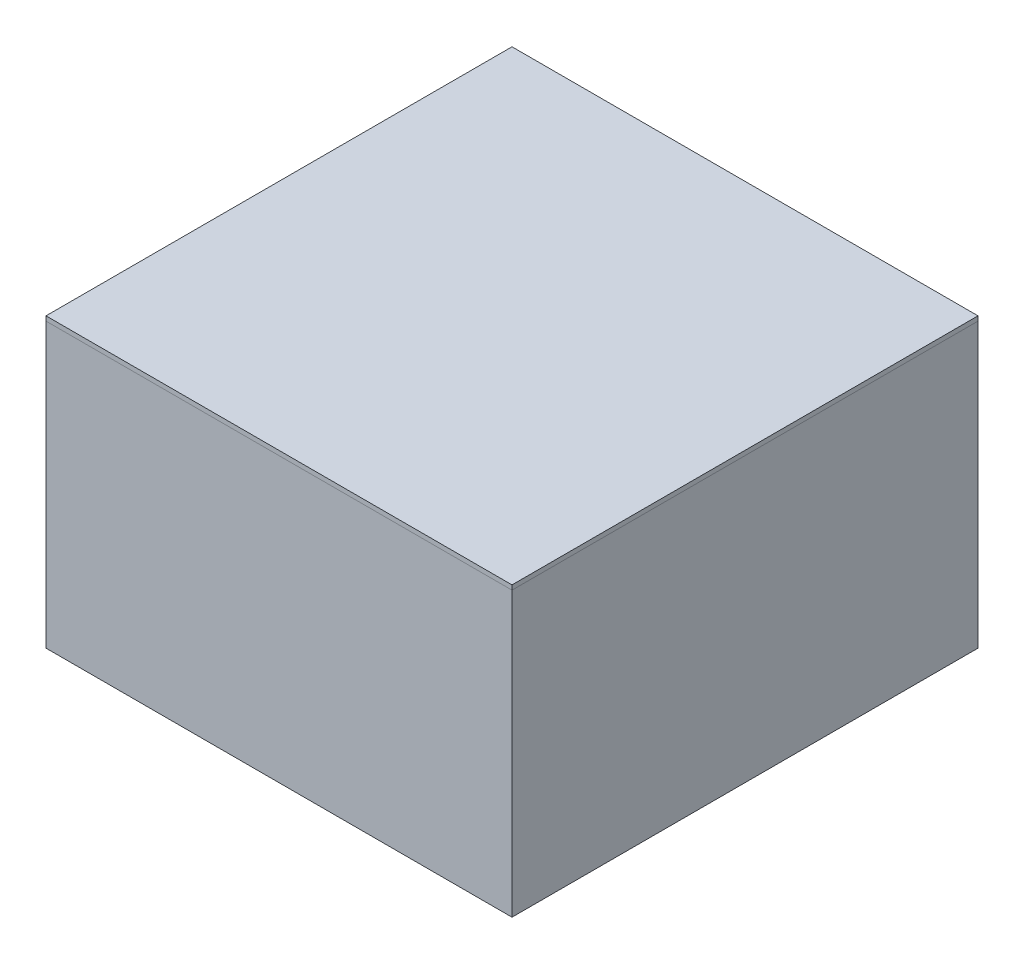
ISO-10303-21;
HEADER;
FILE_DESCRIPTION(('STEP AP214'),'2;1');
FILE_NAME('part.step','',(''),(''),'','','');
FILE_SCHEMA(('AUTOMOTIVE_DESIGN { 1 0 10303 214 1 1 1 1 }'));
ENDSEC;
DATA;
#1=APPLICATION_CONTEXT('core data for automotive mechanical design processes');
#2=APPLICATION_PROTOCOL_DEFINITION('international standard','automotive_design',2000,#1);
#3=PRODUCT_CONTEXT('',#1,'mechanical');
#4=PRODUCT('Part','Part','',(#3));
#5=PRODUCT_RELATED_PRODUCT_CATEGORY('part','',(#4));
#6=PRODUCT_DEFINITION_FORMATION('','',#4);
#7=PRODUCT_DEFINITION_CONTEXT('part definition',#1,'design');
#8=PRODUCT_DEFINITION('design','',#6,#7);
#9=PRODUCT_DEFINITION_SHAPE('','',#8);
#10=(LENGTH_UNIT() NAMED_UNIT(*) SI_UNIT(.MILLI.,.METRE.));
#11=(NAMED_UNIT(*) PLANE_ANGLE_UNIT() SI_UNIT($,.RADIAN.));
#12=(NAMED_UNIT(*) SI_UNIT($,.STERADIAN.) SOLID_ANGLE_UNIT());
#13=UNCERTAINTY_MEASURE_WITH_UNIT(LENGTH_MEASURE(1.E-05),#10,'distance_accuracy_value','');
#14=(GEOMETRIC_REPRESENTATION_CONTEXT(3) GLOBAL_UNCERTAINTY_ASSIGNED_CONTEXT((#13)) GLOBAL_UNIT_ASSIGNED_CONTEXT((#10,
#11,#12)) REPRESENTATION_CONTEXT('',''));
#15=CARTESIAN_POINT('',(0.,0.,0.));
#16=DIRECTION('',(0.,0.,1.));
#17=DIRECTION('',(1.,0.,0.));
#18=AXIS2_PLACEMENT_3D('',#15,#16,#17);
#19=CARTESIAN_POINT('',(-49.9,29.5,-49.9));
#20=DIRECTION('',(-1.,0.,0.));
#21=DIRECTION('',(0.,0.,1.));
#22=AXIS2_PLACEMENT_3D('',#19,#20,#21);
#23=PLANE('',#22);
#24=DIRECTION('',(0.,0.,1.));
#25=VECTOR('',#24,1.);
#26=CARTESIAN_POINT('',(-49.9,31.,-49.9));
#27=LINE('',#26,#25);
#28=CARTESIAN_POINT('',(-49.9,31.,-49.9));
#29=VERTEX_POINT('',#28);
#30=CARTESIAN_POINT('',(-49.9,31.,49.9));
#31=VERTEX_POINT('',#30);
#32=EDGE_CURVE('E148',#29,#31,#27,.T.);
#33=ORIENTED_EDGE('',*,*,#32,.F.);
#34=DIRECTION('',(0.,1.,0.));
#35=VECTOR('',#34,1.);
#36=CARTESIAN_POINT('',(-49.9,29.5,-49.9));
#37=LINE('',#36,#35);
#38=CARTESIAN_POINT('',(-49.9,29.5,-49.9));
#39=VERTEX_POINT('',#38);
#40=EDGE_CURVE('E12',#39,#29,#37,.T.);
#41=ORIENTED_EDGE('',*,*,#40,.F.);
#42=DIRECTION('',(0.,0.,1.));
#43=VECTOR('',#42,1.);
#44=CARTESIAN_POINT('',(-49.9,29.5,-49.9));
#45=LINE('',#44,#43);
#46=CARTESIAN_POINT('',(-49.9,29.5,49.9));
#47=VERTEX_POINT('',#46);
#48=EDGE_CURVE('E157',#39,#47,#45,.T.);
#49=ORIENTED_EDGE('',*,*,#48,.T.);
#50=DIRECTION('',(0.,1.,0.));
#51=VECTOR('',#50,1.);
#52=CARTESIAN_POINT('',(-49.9,29.5,49.9));
#53=LINE('',#52,#51);
#54=EDGE_CURVE('E56',#47,#31,#53,.T.);
#55=ORIENTED_EDGE('',*,*,#54,.T.);
#56=EDGE_LOOP('',(#33,#41,#49,#55));
#57=FACE_BOUND('',#56,.T.);
#58=ADVANCED_FACE('F53',(#57),#23,.T.);
#59=CARTESIAN_POINT('',(49.9,29.5,-49.9));
#60=DIRECTION('',(0.,0.,-1.));
#61=DIRECTION('',(-1.,0.,0.));
#62=AXIS2_PLACEMENT_3D('',#59,#60,#61);
#63=PLANE('',#62);
#64=DIRECTION('',(-1.,0.,0.));
#65=VECTOR('',#64,1.);
#66=CARTESIAN_POINT('',(49.9,31.,-49.9));
#67=LINE('',#66,#65);
#68=CARTESIAN_POINT('',(49.9,31.,-49.9));
#69=VERTEX_POINT('',#68);
#70=EDGE_CURVE('E160',#69,#29,#67,.T.);
#71=ORIENTED_EDGE('',*,*,#70,.F.);
#72=DIRECTION('',(0.,1.,0.));
#73=VECTOR('',#72,1.);
#74=CARTESIAN_POINT('',(49.9,29.5,-49.9));
#75=LINE('',#74,#73);
#76=CARTESIAN_POINT('',(49.9,29.5,-49.9));
#77=VERTEX_POINT('',#76);
#78=EDGE_CURVE('E62',#77,#69,#75,.T.);
#79=ORIENTED_EDGE('',*,*,#78,.F.);
#80=DIRECTION('',(-1.,0.,0.));
#81=VECTOR('',#80,1.);
#82=CARTESIAN_POINT('',(49.9,29.5,-49.9));
#83=LINE('',#82,#81);
#84=EDGE_CURVE('E164',#77,#39,#83,.T.);
#85=ORIENTED_EDGE('',*,*,#84,.T.);
#86=ORIENTED_EDGE('',*,*,#40,.T.);
#87=EDGE_LOOP('',(#71,#79,#85,#86));
#88=FACE_BOUND('',#87,.T.);
#89=ADVANCED_FACE('F178',(#88),#63,.T.);
#90=CARTESIAN_POINT('',(49.9,29.5,49.9));
#91=DIRECTION('',(1.,0.,0.));
#92=DIRECTION('',(0.,0.,-1.));
#93=AXIS2_PLACEMENT_3D('',#90,#91,#92);
#94=PLANE('',#93);
#95=DIRECTION('',(0.,0.,-1.));
#96=VECTOR('',#95,1.);
#97=CARTESIAN_POINT('',(49.9,31.,49.9));
#98=LINE('',#97,#96);
#99=CARTESIAN_POINT('',(49.9,31.,49.9));
#100=VERTEX_POINT('',#99);
#101=EDGE_CURVE('E169',#100,#69,#98,.T.);
#102=ORIENTED_EDGE('',*,*,#101,.F.);
#103=DIRECTION('',(0.,1.,0.));
#104=VECTOR('',#103,1.);
#105=CARTESIAN_POINT('',(49.9,29.5,49.9));
#106=LINE('',#105,#104);
#107=CARTESIAN_POINT('',(49.9,29.5,49.9));
#108=VERTEX_POINT('',#107);
#109=EDGE_CURVE('E85',#108,#100,#106,.T.);
#110=ORIENTED_EDGE('',*,*,#109,.F.);
#111=DIRECTION('',(0.,0.,-1.));
#112=VECTOR('',#111,1.);
#113=CARTESIAN_POINT('',(49.9,29.5,49.9));
#114=LINE('',#113,#112);
#115=EDGE_CURVE('E162',#108,#77,#114,.T.);
#116=ORIENTED_EDGE('',*,*,#115,.T.);
#117=ORIENTED_EDGE('',*,*,#78,.T.);
#118=EDGE_LOOP('',(#102,#110,#116,#117));
#119=FACE_BOUND('',#118,.T.);
#120=ADVANCED_FACE('F183',(#119),#94,.T.);
#121=CARTESIAN_POINT('',(-49.9,29.5,49.9));
#122=DIRECTION('',(0.,0.,1.));
#123=DIRECTION('',(1.,0.,0.));
#124=AXIS2_PLACEMENT_3D('',#121,#122,#123);
#125=PLANE('',#124);
#126=DIRECTION('',(1.,0.,0.));
#127=VECTOR('',#126,1.);
#128=CARTESIAN_POINT('',(-49.9,31.,49.9));
#129=LINE('',#128,#127);
#130=EDGE_CURVE('E151',#31,#100,#129,.T.);
#131=ORIENTED_EDGE('',*,*,#130,.F.);
#132=ORIENTED_EDGE('',*,*,#54,.F.);
#133=DIRECTION('',(1.,0.,0.));
#134=VECTOR('',#133,1.);
#135=CARTESIAN_POINT('',(-49.9,29.5,49.9));
#136=LINE('',#135,#134);
#137=EDGE_CURVE('E159',#47,#108,#136,.T.);
#138=ORIENTED_EDGE('',*,*,#137,.T.);
#139=ORIENTED_EDGE('',*,*,#109,.T.);
#140=EDGE_LOOP('',(#131,#132,#138,#139));
#141=FACE_BOUND('',#140,.T.);
#142=ADVANCED_FACE('F174',(#141),#125,.T.);
#143=CARTESIAN_POINT('',(0.,29.5,0.));
#144=DIRECTION('',(0.,1.,0.));
#145=DIRECTION('',(0.,0.,1.));
#146=AXIS2_PLACEMENT_3D('',#143,#144,#145);
#147=PLANE('',#146);
#148=ORIENTED_EDGE('',*,*,#48,.F.);
#149=ORIENTED_EDGE('',*,*,#84,.F.);
#150=ORIENTED_EDGE('',*,*,#115,.F.);
#151=ORIENTED_EDGE('',*,*,#137,.F.);
#152=EDGE_LOOP('',(#148,#149,#150,#151));
#153=FACE_BOUND('',#152,.T.);
#154=ADVANCED_FACE('F182',(#153),#147,.F.);
#155=CARTESIAN_POINT('',(0.,31.,0.));
#156=DIRECTION('',(0.,1.,0.));
#157=DIRECTION('',(0.,0.,1.));
#158=AXIS2_PLACEMENT_3D('',#155,#156,#157);
#159=PLANE('',#158);
#160=DIRECTION('',(0.,0.,1.));
#161=VECTOR('',#160,1.);
#162=CARTESIAN_POINT('',(-51.,31.,-51.));
#163=LINE('',#162,#161);
#164=CARTESIAN_POINT('',(-51.,31.,-51.));
#165=VERTEX_POINT('',#164);
#166=CARTESIAN_POINT('',(-51.,31.,51.));
#167=VERTEX_POINT('',#166);
#168=EDGE_CURVE('E147',#165,#167,#163,.T.);
#169=ORIENTED_EDGE('',*,*,#168,.F.);
#170=DIRECTION('',(-1.,0.,0.));
#171=VECTOR('',#170,1.);
#172=CARTESIAN_POINT('',(-51.,31.,-51.));
#173=LINE('',#172,#171);
#174=CARTESIAN_POINT('',(51.,31.,-51.));
#175=VERTEX_POINT('',#174);
#176=EDGE_CURVE('E143',#175,#165,#173,.T.);
#177=ORIENTED_EDGE('',*,*,#176,.F.);
#178=DIRECTION('',(0.,0.,-1.));
#179=VECTOR('',#178,1.);
#180=CARTESIAN_POINT('',(51.,31.,-51.));
#181=LINE('',#180,#179);
#182=CARTESIAN_POINT('',(51.,31.,51.));
#183=VERTEX_POINT('',#182);
#184=EDGE_CURVE('E279',#183,#175,#181,.T.);
#185=ORIENTED_EDGE('',*,*,#184,.F.);
#186=DIRECTION('',(1.,0.,0.));
#187=VECTOR('',#186,1.);
#188=CARTESIAN_POINT('',(-51.,31.,51.));
#189=LINE('',#188,#187);
#190=EDGE_CURVE('E282',#167,#183,#189,.T.);
#191=ORIENTED_EDGE('',*,*,#190,.F.);
#192=EDGE_LOOP('',(#169,#177,#185,#191));
#193=FACE_BOUND('',#192,.T.);
#194=ORIENTED_EDGE('',*,*,#70,.T.);
#195=ORIENTED_EDGE('',*,*,#32,.T.);
#196=ORIENTED_EDGE('',*,*,#130,.T.);
#197=ORIENTED_EDGE('',*,*,#101,.T.);
#198=EDGE_LOOP('',(#194,#195,#196,#197));
#199=FACE_BOUND('',#198,.T.);
#200=ADVANCED_FACE('F176',(#193,#199),#159,.F.);
#201=CARTESIAN_POINT('',(-51.,32.,-51.));
#202=DIRECTION('',(1.,0.,0.));
#203=DIRECTION('',(0.,0.,-1.));
#204=AXIS2_PLACEMENT_3D('',#201,#202,#203);
#205=PLANE('',#204);
#206=ORIENTED_EDGE('',*,*,#168,.T.);
#207=DIRECTION('',(0.,-1.,0.));
#208=VECTOR('',#207,1.);
#209=CARTESIAN_POINT('',(-51.,32.,51.));
#210=LINE('',#209,#208);
#211=CARTESIAN_POINT('',(-51.,32.,51.));
#212=VERTEX_POINT('',#211);
#213=EDGE_CURVE('E127',#212,#167,#210,.T.);
#214=ORIENTED_EDGE('',*,*,#213,.F.);
#215=DIRECTION('',(0.,0.,1.));
#216=VECTOR('',#215,1.);
#217=CARTESIAN_POINT('',(-51.,32.,-51.));
#218=LINE('',#217,#216);
#219=CARTESIAN_POINT('',(-51.,32.,-51.));
#220=VERTEX_POINT('',#219);
#221=EDGE_CURVE('E134',#220,#212,#218,.T.);
#222=ORIENTED_EDGE('',*,*,#221,.F.);
#223=DIRECTION('',(0.,-1.,0.));
#224=VECTOR('',#223,1.);
#225=CARTESIAN_POINT('',(-51.,32.,-51.));
#226=LINE('',#225,#224);
#227=EDGE_CURVE('E276',#220,#165,#226,.T.);
#228=ORIENTED_EDGE('',*,*,#227,.T.);
#229=EDGE_LOOP('',(#206,#214,#222,#228));
#230=FACE_BOUND('',#229,.T.);
#231=ADVANCED_FACE('F145',(#230),#205,.F.);
#232=CARTESIAN_POINT('',(-51.,32.,51.));
#233=DIRECTION('',(0.,0.,-1.));
#234=DIRECTION('',(-1.,0.,0.));
#235=AXIS2_PLACEMENT_3D('',#232,#233,#234);
#236=PLANE('',#235);
#237=ORIENTED_EDGE('',*,*,#190,.T.);
#238=DIRECTION('',(0.,-1.,0.));
#239=VECTOR('',#238,1.);
#240=CARTESIAN_POINT('',(51.,32.,51.));
#241=LINE('',#240,#239);
#242=CARTESIAN_POINT('',(51.,32.,51.));
#243=VERTEX_POINT('',#242);
#244=EDGE_CURVE('E130',#243,#183,#241,.T.);
#245=ORIENTED_EDGE('',*,*,#244,.F.);
#246=DIRECTION('',(1.,0.,0.));
#247=VECTOR('',#246,1.);
#248=CARTESIAN_POINT('',(-51.,32.,51.));
#249=LINE('',#248,#247);
#250=EDGE_CURVE('E123',#212,#243,#249,.T.);
#251=ORIENTED_EDGE('',*,*,#250,.F.);
#252=ORIENTED_EDGE('',*,*,#213,.T.);
#253=EDGE_LOOP('',(#237,#245,#251,#252));
#254=FACE_BOUND('',#253,.T.);
#255=ADVANCED_FACE('F125',(#254),#236,.F.);
#256=CARTESIAN_POINT('',(51.,32.,-51.));
#257=DIRECTION('',(-1.,0.,0.));
#258=DIRECTION('',(0.,0.,1.));
#259=AXIS2_PLACEMENT_3D('',#256,#257,#258);
#260=PLANE('',#259);
#261=ORIENTED_EDGE('',*,*,#184,.T.);
#262=DIRECTION('',(0.,-1.,0.));
#263=VECTOR('',#262,1.);
#264=CARTESIAN_POINT('',(51.,32.,-51.));
#265=LINE('',#264,#263);
#266=CARTESIAN_POINT('',(51.,32.,-51.));
#267=VERTEX_POINT('',#266);
#268=EDGE_CURVE('E153',#267,#175,#265,.T.);
#269=ORIENTED_EDGE('',*,*,#268,.F.);
#270=DIRECTION('',(0.,0.,-1.));
#271=VECTOR('',#270,1.);
#272=CARTESIAN_POINT('',(51.,32.,-51.));
#273=LINE('',#272,#271);
#274=EDGE_CURVE('E133',#243,#267,#273,.T.);
#275=ORIENTED_EDGE('',*,*,#274,.F.);
#276=ORIENTED_EDGE('',*,*,#244,.T.);
#277=EDGE_LOOP('',(#261,#269,#275,#276));
#278=FACE_BOUND('',#277,.T.);
#279=ADVANCED_FACE('F244',(#278),#260,.F.);
#280=CARTESIAN_POINT('',(-51.,32.,-51.));
#281=DIRECTION('',(0.,0.,1.));
#282=DIRECTION('',(1.,0.,0.));
#283=AXIS2_PLACEMENT_3D('',#280,#281,#282);
#284=PLANE('',#283);
#285=ORIENTED_EDGE('',*,*,#176,.T.);
#286=ORIENTED_EDGE('',*,*,#227,.F.);
#287=DIRECTION('',(-1.,0.,0.));
#288=VECTOR('',#287,1.);
#289=CARTESIAN_POINT('',(-51.,32.,-51.));
#290=LINE('',#289,#288);
#291=EDGE_CURVE('E139',#267,#220,#290,.T.);
#292=ORIENTED_EDGE('',*,*,#291,.F.);
#293=ORIENTED_EDGE('',*,*,#268,.T.);
#294=EDGE_LOOP('',(#285,#286,#292,#293));
#295=FACE_BOUND('',#294,.T.);
#296=ADVANCED_FACE('F253',(#295),#284,.F.);
#297=CARTESIAN_POINT('',(0.,32.,0.));
#298=DIRECTION('',(0.,1.,0.));
#299=DIRECTION('',(0.,0.,1.));
#300=AXIS2_PLACEMENT_3D('',#297,#298,#299);
#301=PLANE('',#300);
#302=ORIENTED_EDGE('',*,*,#221,.T.);
#303=ORIENTED_EDGE('',*,*,#250,.T.);
#304=ORIENTED_EDGE('',*,*,#274,.T.);
#305=ORIENTED_EDGE('',*,*,#291,.T.);
#306=EDGE_LOOP('',(#302,#303,#304,#305));
#307=FACE_BOUND('',#306,.T.);
#308=ADVANCED_FACE('F137',(#307),#301,.T.);
#309=CLOSED_SHELL('',(#58,#89,#120,#142,#154,#200,#231,#255,#279,#296,#308));
#310=MANIFOLD_SOLID_BREP('B2',#309);
#311=CARTESIAN_POINT('',(0.,31.,0.));
#312=DIRECTION('',(0.,-1.,0.));
#313=DIRECTION('',(0.,0.,-1.));
#314=AXIS2_PLACEMENT_3D('',#311,#312,#313);
#315=PLANE('',#314);
#316=DIRECTION('',(0.,0.,-1.));
#317=VECTOR('',#316,1.);
#318=CARTESIAN_POINT('',(51.,31.,51.));
#319=LINE('',#318,#317);
#320=CARTESIAN_POINT('',(51.,31.,51.));
#321=VERTEX_POINT('',#320);
#322=CARTESIAN_POINT('',(51.,31.,-51.));
#323=VERTEX_POINT('',#322);
#324=EDGE_CURVE('E400',#321,#323,#319,.T.);
#325=ORIENTED_EDGE('',*,*,#324,.T.);
#326=DIRECTION('',(-1.,0.,0.));
#327=VECTOR('',#326,1.);
#328=CARTESIAN_POINT('',(-51.,31.,-51.));
#329=LINE('',#328,#327);
#330=CARTESIAN_POINT('',(-51.,31.,-51.));
#331=VERTEX_POINT('',#330);
#332=EDGE_CURVE('E344',#323,#331,#329,.T.);
#333=ORIENTED_EDGE('',*,*,#332,.T.);
#334=DIRECTION('',(0.,0.,1.));
#335=VECTOR('',#334,1.);
#336=CARTESIAN_POINT('',(-51.,31.,51.));
#337=LINE('',#336,#335);
#338=CARTESIAN_POINT('',(-51.,31.,51.));
#339=VERTEX_POINT('',#338);
#340=EDGE_CURVE('E403',#331,#339,#337,.T.);
#341=ORIENTED_EDGE('',*,*,#340,.T.);
#342=DIRECTION('',(1.,0.,0.));
#343=VECTOR('',#342,1.);
#344=CARTESIAN_POINT('',(-51.,31.,51.));
#345=LINE('',#344,#343);
#346=EDGE_CURVE('E316',#339,#321,#345,.T.);
#347=ORIENTED_EDGE('',*,*,#346,.T.);
#348=EDGE_LOOP('',(#325,#333,#341,#347));
#349=FACE_BOUND('',#348,.T.);
#350=DIRECTION('',(0.,0.,-1.));
#351=VECTOR('',#350,1.);
#352=CARTESIAN_POINT('',(50.,31.,0.));
#353=LINE('',#352,#351);
#354=CARTESIAN_POINT('',(50.,31.,50.));
#355=VERTEX_POINT('',#354);
#356=CARTESIAN_POINT('',(50.,31.,-50.));
#357=VERTEX_POINT('',#356);
#358=EDGE_CURVE('E389',#355,#357,#353,.T.);
#359=ORIENTED_EDGE('',*,*,#358,.F.);
#360=DIRECTION('',(1.,0.,0.));
#361=VECTOR('',#360,1.);
#362=CARTESIAN_POINT('',(0.,31.,50.));
#363=LINE('',#362,#361);
#364=CARTESIAN_POINT('',(-50.,31.,50.));
#365=VERTEX_POINT('',#364);
#366=EDGE_CURVE('E398',#365,#355,#363,.T.);
#367=ORIENTED_EDGE('',*,*,#366,.F.);
#368=DIRECTION('',(0.,0.,1.));
#369=VECTOR('',#368,1.);
#370=CARTESIAN_POINT('',(-50.,31.,0.));
#371=LINE('',#370,#369);
#372=CARTESIAN_POINT('',(-50.,31.,-50.));
#373=VERTEX_POINT('',#372);
#374=EDGE_CURVE('E396',#373,#365,#371,.T.);
#375=ORIENTED_EDGE('',*,*,#374,.F.);
#376=DIRECTION('',(-1.,0.,0.));
#377=VECTOR('',#376,1.);
#378=CARTESIAN_POINT('',(0.,31.,-50.));
#379=LINE('',#378,#377);
#380=EDGE_CURVE('E381',#357,#373,#379,.T.);
#381=ORIENTED_EDGE('',*,*,#380,.F.);
#382=EDGE_LOOP('',(#359,#367,#375,#381));
#383=FACE_BOUND('',#382,.T.);
#384=ADVANCED_FACE('F292',(#349,#383),#315,.F.);
#385=CARTESIAN_POINT('',(51.,31.,51.));
#386=DIRECTION('',(-1.,0.,0.));
#387=DIRECTION('',(0.,0.,1.));
#388=AXIS2_PLACEMENT_3D('',#385,#386,#387);
#389=PLANE('',#388);
#390=DIRECTION('',(0.,0.,-1.));
#391=VECTOR('',#390,1.);
#392=CARTESIAN_POINT('',(51.,-31.,51.));
#393=LINE('',#392,#391);
#394=CARTESIAN_POINT('',(51.,-31.,51.));
#395=VERTEX_POINT('',#394);
#396=CARTESIAN_POINT('',(51.,-31.,-51.));
#397=VERTEX_POINT('',#396);
#398=EDGE_CURVE('E407',#395,#397,#393,.T.);
#399=ORIENTED_EDGE('',*,*,#398,.T.);
#400=DIRECTION('',(0.,-1.,0.));
#401=VECTOR('',#400,1.);
#402=CARTESIAN_POINT('',(51.,31.,-51.));
#403=LINE('',#402,#401);
#404=EDGE_CURVE('E51',#323,#397,#403,.T.);
#405=ORIENTED_EDGE('',*,*,#404,.F.);
#406=ORIENTED_EDGE('',*,*,#324,.F.);
#407=DIRECTION('',(0.,-1.,0.));
#408=VECTOR('',#407,1.);
#409=CARTESIAN_POINT('',(51.,31.,51.));
#410=LINE('',#409,#408);
#411=EDGE_CURVE('E406',#321,#395,#410,.T.);
#412=ORIENTED_EDGE('',*,*,#411,.T.);
#413=EDGE_LOOP('',(#399,#405,#406,#412));
#414=FACE_BOUND('',#413,.T.);
#415=ADVANCED_FACE('F294',(#414),#389,.F.);
#416=CARTESIAN_POINT('',(-51.,31.,-51.));
#417=DIRECTION('',(0.,0.,1.));
#418=DIRECTION('',(1.,0.,0.));
#419=AXIS2_PLACEMENT_3D('',#416,#417,#418);
#420=PLANE('',#419);
#421=DIRECTION('',(-1.,0.,0.));
#422=VECTOR('',#421,1.);
#423=CARTESIAN_POINT('',(-51.,-31.,-51.));
#424=LINE('',#423,#422);
#425=CARTESIAN_POINT('',(-51.,-31.,-51.));
#426=VERTEX_POINT('',#425);
#427=EDGE_CURVE('E410',#397,#426,#424,.T.);
#428=ORIENTED_EDGE('',*,*,#427,.T.);
#429=DIRECTION('',(0.,-1.,0.));
#430=VECTOR('',#429,1.);
#431=CARTESIAN_POINT('',(-51.,31.,-51.));
#432=LINE('',#431,#430);
#433=EDGE_CURVE('E300',#331,#426,#432,.T.);
#434=ORIENTED_EDGE('',*,*,#433,.F.);
#435=ORIENTED_EDGE('',*,*,#332,.F.);
#436=ORIENTED_EDGE('',*,*,#404,.T.);
#437=EDGE_LOOP('',(#428,#434,#435,#436));
#438=FACE_BOUND('',#437,.T.);
#439=ADVANCED_FACE('F438',(#438),#420,.F.);
#440=CARTESIAN_POINT('',(-51.,31.,51.));
#441=DIRECTION('',(1.,0.,0.));
#442=DIRECTION('',(0.,0.,-1.));
#443=AXIS2_PLACEMENT_3D('',#440,#441,#442);
#444=PLANE('',#443);
#445=DIRECTION('',(0.,0.,1.));
#446=VECTOR('',#445,1.);
#447=CARTESIAN_POINT('',(-51.,-31.,51.));
#448=LINE('',#447,#446);
#449=CARTESIAN_POINT('',(-51.,-31.,51.));
#450=VERTEX_POINT('',#449);
#451=EDGE_CURVE('E412',#426,#450,#448,.T.);
#452=ORIENTED_EDGE('',*,*,#451,.T.);
#453=DIRECTION('',(0.,-1.,0.));
#454=VECTOR('',#453,1.);
#455=CARTESIAN_POINT('',(-51.,31.,51.));
#456=LINE('',#455,#454);
#457=EDGE_CURVE('E416',#339,#450,#456,.T.);
#458=ORIENTED_EDGE('',*,*,#457,.F.);
#459=ORIENTED_EDGE('',*,*,#340,.F.);
#460=ORIENTED_EDGE('',*,*,#433,.T.);
#461=EDGE_LOOP('',(#452,#458,#459,#460));
#462=FACE_BOUND('',#461,.T.);
#463=ADVANCED_FACE('F421',(#462),#444,.F.);
#464=CARTESIAN_POINT('',(-51.,31.,51.));
#465=DIRECTION('',(0.,0.,-1.));
#466=DIRECTION('',(-1.,0.,0.));
#467=AXIS2_PLACEMENT_3D('',#464,#465,#466);
#468=PLANE('',#467);
#469=DIRECTION('',(1.,0.,0.));
#470=VECTOR('',#469,1.);
#471=CARTESIAN_POINT('',(-51.,-31.,51.));
#472=LINE('',#471,#470);
#473=EDGE_CURVE('E337',#450,#395,#472,.T.);
#474=ORIENTED_EDGE('',*,*,#473,.T.);
#475=ORIENTED_EDGE('',*,*,#411,.F.);
#476=ORIENTED_EDGE('',*,*,#346,.F.);
#477=ORIENTED_EDGE('',*,*,#457,.T.);
#478=EDGE_LOOP('',(#474,#475,#476,#477));
#479=FACE_BOUND('',#478,.T.);
#480=ADVANCED_FACE('F429',(#479),#468,.F.);
#481=CARTESIAN_POINT('',(0.,-31.,0.));
#482=DIRECTION('',(0.,-1.,0.));
#483=DIRECTION('',(0.,0.,-1.));
#484=AXIS2_PLACEMENT_3D('',#481,#482,#483);
#485=PLANE('',#484);
#486=ORIENTED_EDGE('',*,*,#398,.F.);
#487=ORIENTED_EDGE('',*,*,#473,.F.);
#488=ORIENTED_EDGE('',*,*,#451,.F.);
#489=ORIENTED_EDGE('',*,*,#427,.F.);
#490=EDGE_LOOP('',(#486,#487,#488,#489));
#491=FACE_BOUND('',#490,.T.);
#492=ADVANCED_FACE('F425',(#491),#485,.T.);
#493=CARTESIAN_POINT('',(50.,31.,51.));
#494=DIRECTION('',(-1.,0.,0.));
#495=DIRECTION('',(0.,0.,1.));
#496=AXIS2_PLACEMENT_3D('',#493,#494,#495);
#497=PLANE('',#496);
#498=DIRECTION('',(0.,0.,-1.));
#499=VECTOR('',#498,1.);
#500=CARTESIAN_POINT('',(50.,-30.,0.));
#501=LINE('',#500,#499);
#502=CARTESIAN_POINT('',(50.,-30.,50.));
#503=VERTEX_POINT('',#502);
#504=CARTESIAN_POINT('',(50.,-30.,-50.));
#505=VERTEX_POINT('',#504);
#506=EDGE_CURVE('E372',#503,#505,#501,.T.);
#507=ORIENTED_EDGE('',*,*,#506,.F.);
#508=DIRECTION('',(0.,-1.,0.));
#509=VECTOR('',#508,1.);
#510=CARTESIAN_POINT('',(50.,31.,50.));
#511=LINE('',#510,#509);
#512=EDGE_CURVE('E392',#355,#503,#511,.T.);
#513=ORIENTED_EDGE('',*,*,#512,.F.);
#514=ORIENTED_EDGE('',*,*,#358,.T.);
#515=DIRECTION('',(0.,-1.,0.));
#516=VECTOR('',#515,1.);
#517=CARTESIAN_POINT('',(50.,31.,-50.));
#518=LINE('',#517,#516);
#519=EDGE_CURVE('E384',#357,#505,#518,.T.);
#520=ORIENTED_EDGE('',*,*,#519,.T.);
#521=EDGE_LOOP('',(#507,#513,#514,#520));
#522=FACE_BOUND('',#521,.T.);
#523=ADVANCED_FACE('F436',(#522),#497,.T.);
#524=CARTESIAN_POINT('',(-51.,31.,-50.));
#525=DIRECTION('',(0.,0.,1.));
#526=DIRECTION('',(1.,0.,0.));
#527=AXIS2_PLACEMENT_3D('',#524,#525,#526);
#528=PLANE('',#527);
#529=DIRECTION('',(-1.,0.,0.));
#530=VECTOR('',#529,1.);
#531=CARTESIAN_POINT('',(0.,-30.,-50.));
#532=LINE('',#531,#530);
#533=CARTESIAN_POINT('',(-50.,-30.,-50.));
#534=VERTEX_POINT('',#533);
#535=EDGE_CURVE('E366',#505,#534,#532,.T.);
#536=ORIENTED_EDGE('',*,*,#535,.F.);
#537=ORIENTED_EDGE('',*,*,#519,.F.);
#538=ORIENTED_EDGE('',*,*,#380,.T.);
#539=DIRECTION('',(0.,-1.,0.));
#540=VECTOR('',#539,1.);
#541=CARTESIAN_POINT('',(-50.,31.,-50.));
#542=LINE('',#541,#540);
#543=EDGE_CURVE('E378',#373,#534,#542,.T.);
#544=ORIENTED_EDGE('',*,*,#543,.T.);
#545=EDGE_LOOP('',(#536,#537,#538,#544));
#546=FACE_BOUND('',#545,.T.);
#547=ADVANCED_FACE('F379',(#546),#528,.T.);
#548=CARTESIAN_POINT('',(-50.,31.,51.));
#549=DIRECTION('',(1.,0.,0.));
#550=DIRECTION('',(0.,0.,-1.));
#551=AXIS2_PLACEMENT_3D('',#548,#549,#550);
#552=PLANE('',#551);
#553=DIRECTION('',(0.,0.,1.));
#554=VECTOR('',#553,1.);
#555=CARTESIAN_POINT('',(-50.,-30.,0.));
#556=LINE('',#555,#554);
#557=CARTESIAN_POINT('',(-50.,-30.,50.));
#558=VERTEX_POINT('',#557);
#559=EDGE_CURVE('E370',#534,#558,#556,.T.);
#560=ORIENTED_EDGE('',*,*,#559,.F.);
#561=ORIENTED_EDGE('',*,*,#543,.F.);
#562=ORIENTED_EDGE('',*,*,#374,.T.);
#563=DIRECTION('',(0.,-1.,0.));
#564=VECTOR('',#563,1.);
#565=CARTESIAN_POINT('',(-50.,31.,50.));
#566=LINE('',#565,#564);
#567=EDGE_CURVE('E307',#365,#558,#566,.T.);
#568=ORIENTED_EDGE('',*,*,#567,.T.);
#569=EDGE_LOOP('',(#560,#561,#562,#568));
#570=FACE_BOUND('',#569,.T.);
#571=ADVANCED_FACE('F386',(#570),#552,.T.);
#572=CARTESIAN_POINT('',(-51.,31.,50.));
#573=DIRECTION('',(0.,0.,-1.));
#574=DIRECTION('',(-1.,0.,0.));
#575=AXIS2_PLACEMENT_3D('',#572,#573,#574);
#576=PLANE('',#575);
#577=DIRECTION('',(1.,0.,0.));
#578=VECTOR('',#577,1.);
#579=CARTESIAN_POINT('',(0.,-30.,50.));
#580=LINE('',#579,#578);
#581=EDGE_CURVE('E387',#558,#503,#580,.T.);
#582=ORIENTED_EDGE('',*,*,#581,.F.);
#583=ORIENTED_EDGE('',*,*,#567,.F.);
#584=ORIENTED_EDGE('',*,*,#366,.T.);
#585=ORIENTED_EDGE('',*,*,#512,.T.);
#586=EDGE_LOOP('',(#582,#583,#584,#585));
#587=FACE_BOUND('',#586,.T.);
#588=ADVANCED_FACE('F450',(#587),#576,.T.);
#589=CARTESIAN_POINT('',(0.,-30.,0.));
#590=DIRECTION('',(0.,-1.,0.));
#591=DIRECTION('',(0.,0.,-1.));
#592=AXIS2_PLACEMENT_3D('',#589,#590,#591);
#593=PLANE('',#592);
#594=ORIENTED_EDGE('',*,*,#506,.T.);
#595=ORIENTED_EDGE('',*,*,#535,.T.);
#596=ORIENTED_EDGE('',*,*,#559,.T.);
#597=ORIENTED_EDGE('',*,*,#581,.T.);
#598=EDGE_LOOP('',(#594,#595,#596,#597));
#599=FACE_BOUND('',#598,.T.);
#600=ADVANCED_FACE('F368',(#599),#593,.F.);
#601=CLOSED_SHELL('',(#384,#415,#439,#463,#480,#492,#523,#547,#571,#588,#600));
#602=MANIFOLD_SOLID_BREP('B6',#601);
#603=ADVANCED_BREP_SHAPE_REPRESENTATION('',(#18,#310,#602),#14);
#604=SHAPE_DEFINITION_REPRESENTATION(#9,#603);
ENDSEC;
END-ISO-10303-21;
